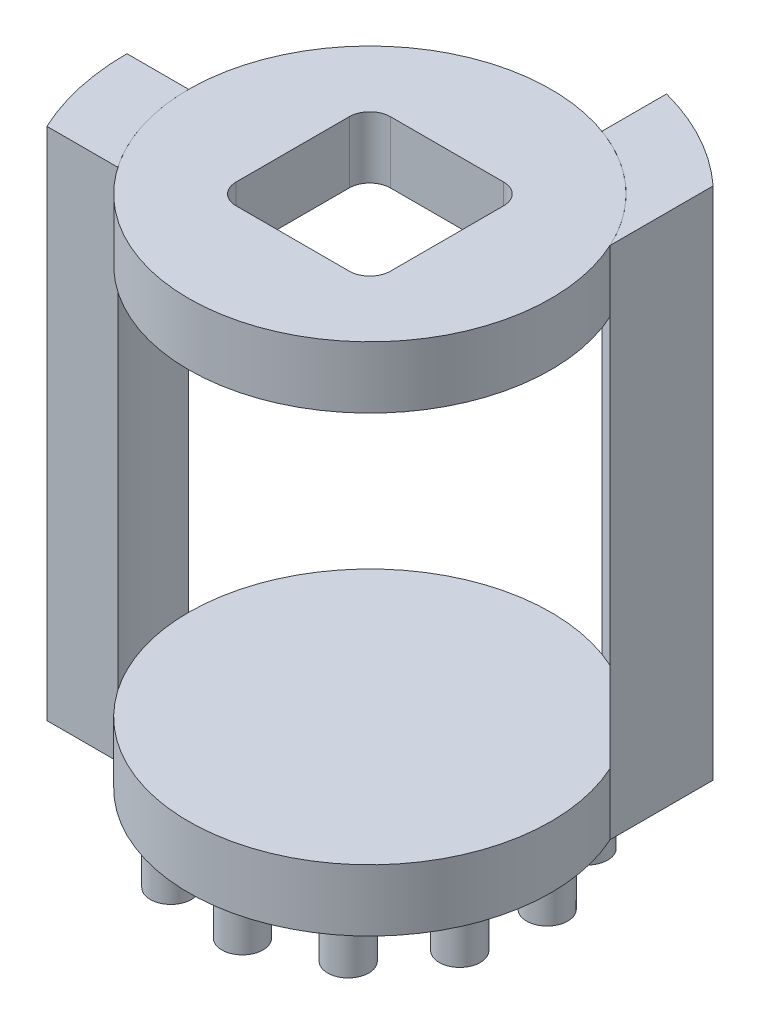
ISO-10303-21;
HEADER;
FILE_DESCRIPTION(('STEP AP214'),'2;1');
FILE_NAME('part.step','',(''),(''),'','','');
FILE_SCHEMA(('AUTOMOTIVE_DESIGN { 1 0 10303 214 1 1 1 1 }'));
ENDSEC;
DATA;
#1=APPLICATION_CONTEXT('core data for automotive mechanical design processes');
#2=APPLICATION_PROTOCOL_DEFINITION('international standard','automotive_design',2000,#1);
#3=PRODUCT_CONTEXT('',#1,'mechanical');
#4=PRODUCT('Part','Part','',(#3));
#5=PRODUCT_RELATED_PRODUCT_CATEGORY('part','',(#4));
#6=PRODUCT_DEFINITION_FORMATION('','',#4);
#7=PRODUCT_DEFINITION_CONTEXT('part definition',#1,'design');
#8=PRODUCT_DEFINITION('design','',#6,#7);
#9=PRODUCT_DEFINITION_SHAPE('','',#8);
#10=(LENGTH_UNIT() NAMED_UNIT(*) SI_UNIT(.MILLI.,.METRE.));
#11=(NAMED_UNIT(*) PLANE_ANGLE_UNIT() SI_UNIT($,.RADIAN.));
#12=(NAMED_UNIT(*) SI_UNIT($,.STERADIAN.) SOLID_ANGLE_UNIT());
#13=UNCERTAINTY_MEASURE_WITH_UNIT(LENGTH_MEASURE(1.E-05),#10,'distance_accuracy_value','');
#14=(GEOMETRIC_REPRESENTATION_CONTEXT(3) GLOBAL_UNCERTAINTY_ASSIGNED_CONTEXT((#13)) GLOBAL_UNIT_ASSIGNED_CONTEXT((#10,
#11,#12)) REPRESENTATION_CONTEXT('',''));
#15=CARTESIAN_POINT('',(0.,0.,0.));
#16=DIRECTION('',(0.,0.,1.));
#17=DIRECTION('',(1.,0.,0.));
#18=AXIS2_PLACEMENT_3D('',#15,#16,#17);
#19=CARTESIAN_POINT('',(0.,-19.,0.));
#20=DIRECTION('',(0.,-1.,0.));
#21=DIRECTION('',(0.,0.,-1.));
#22=AXIS2_PLACEMENT_3D('',#19,#20,#21);
#23=CYLINDRICAL_SURFACE('',#22,8.8);
#24=DIRECTION('',(0.,1.,0.));
#25=VECTOR('',#24,1.);
#26=CARTESIAN_POINT('',(3.,-22.,-8.27284715197857));
#27=LINE('',#26,#25);
#28=CARTESIAN_POINT('',(3.,-22.,-8.27284715197857));
#29=VERTEX_POINT('',#28);
#30=CARTESIAN_POINT('',(3.,-19.,-8.27284715197857));
#31=VERTEX_POINT('',#30);
#32=EDGE_CURVE('E191',#29,#31,#27,.T.);
#33=ORIENTED_EDGE('',*,*,#32,.F.);
#34=CARTESIAN_POINT('',(0.,-22.,0.));
#35=DIRECTION('',(0.,-1.,0.));
#36=DIRECTION('',(1.,0.,0.));
#37=AXIS2_PLACEMENT_3D('',#34,#35,#36);
#38=CIRCLE('',#37,8.8);
#39=CARTESIAN_POINT('',(-8.8,-22.,0.));
#40=VERTEX_POINT('',#39);
#41=EDGE_CURVE('E142',#29,#40,#38,.F.);
#42=ORIENTED_EDGE('',*,*,#41,.T.);
#43=DIRECTION('',(0.,1.,0.));
#44=VECTOR('',#43,1.);
#45=CARTESIAN_POINT('',(-8.8,-22.,0.));
#46=LINE('',#45,#44);
#47=CARTESIAN_POINT('',(-8.8,-19.,0.));
#48=VERTEX_POINT('',#47);
#49=EDGE_CURVE('E12',#40,#48,#46,.T.);
#50=ORIENTED_EDGE('',*,*,#49,.T.);
#51=CARTESIAN_POINT('',(0.,-19.,0.));
#52=DIRECTION('',(0.,-1.,0.));
#53=DIRECTION('',(0.,0.,-1.));
#54=AXIS2_PLACEMENT_3D('',#51,#52,#53);
#55=CIRCLE('',#54,8.8);
#56=EDGE_CURVE('E184',#48,#31,#55,.T.);
#57=ORIENTED_EDGE('',*,*,#56,.T.);
#58=EDGE_LOOP('',(#33,#42,#50,#57));
#59=FACE_BOUND('',#58,.T.);
#60=ADVANCED_FACE('F45',(#59),#23,.T.);
#61=DIRECTION('',(0.,1.,0.));
#62=VECTOR('',#61,1.);
#63=CARTESIAN_POINT('',(-7.24154679609267,-22.,5.));
#64=LINE('',#63,#62);
#65=CARTESIAN_POINT('',(-7.24154679609267,-22.,5.));
#66=VERTEX_POINT('',#65);
#67=CARTESIAN_POINT('',(-7.24154679609267,-19.,5.));
#68=VERTEX_POINT('',#67);
#69=EDGE_CURVE('E130',#66,#68,#64,.T.);
#70=ORIENTED_EDGE('',*,*,#69,.F.);
#71=CARTESIAN_POINT('',(8.,-22.,-3.66606055596467));
#72=VERTEX_POINT('',#71);
#73=EDGE_CURVE('E136',#66,#72,#38,.F.);
#74=ORIENTED_EDGE('',*,*,#73,.T.);
#75=DIRECTION('',(0.,1.,0.));
#76=VECTOR('',#75,1.);
#77=CARTESIAN_POINT('',(8.,-22.,-3.66606055596467));
#78=LINE('',#77,#76);
#79=CARTESIAN_POINT('',(8.,-19.,-3.66606055596467));
#80=VERTEX_POINT('',#79);
#81=EDGE_CURVE('E195',#72,#80,#78,.T.);
#82=ORIENTED_EDGE('',*,*,#81,.T.);
#83=EDGE_CURVE('E146',#80,#68,#55,.T.);
#84=ORIENTED_EDGE('',*,*,#83,.T.);
#85=EDGE_LOOP('',(#70,#74,#82,#84));
#86=FACE_BOUND('',#85,.T.);
#87=ADVANCED_FACE('F145',(#86),#23,.T.);
#88=CARTESIAN_POINT('',(0.,-22.,0.));
#89=DIRECTION('',(0.,1.,0.));
#90=DIRECTION('',(0.,0.,1.));
#91=AXIS2_PLACEMENT_3D('',#88,#89,#90);
#92=PLANE('',#91);
#93=DIRECTION('',(1.,0.,0.));
#94=VECTOR('',#93,1.);
#95=CARTESIAN_POINT('',(0.,-22.,0.));
#96=LINE('',#95,#94);
#97=CARTESIAN_POINT('',(-11.8,-22.,0.));
#98=VERTEX_POINT('',#97);
#99=EDGE_CURVE('E160',#98,#40,#96,.T.);
#100=ORIENTED_EDGE('',*,*,#99,.T.);
#101=ORIENTED_EDGE('',*,*,#41,.F.);
#102=DIRECTION('',(0.,0.,1.));
#103=VECTOR('',#102,1.);
#104=CARTESIAN_POINT('',(3.,-22.,0.));
#105=LINE('',#104,#103);
#106=CARTESIAN_POINT('',(3.,-22.,-11.4122740941497));
#107=VERTEX_POINT('',#106);
#108=EDGE_CURVE('E188',#107,#29,#105,.T.);
#109=ORIENTED_EDGE('',*,*,#108,.F.);
#110=CARTESIAN_POINT('',(0.,-22.,0.));
#111=DIRECTION('',(0.,1.,0.));
#112=DIRECTION('',(0.,0.,1.));
#113=AXIS2_PLACEMENT_3D('',#110,#111,#112);
#114=CIRCLE('',#113,11.8);
#115=CARTESIAN_POINT('',(8.,-22.,-8.67409937688058));
#116=VERTEX_POINT('',#115);
#117=EDGE_CURVE('E210',#116,#107,#114,.T.);
#118=ORIENTED_EDGE('',*,*,#117,.F.);
#119=DIRECTION('',(0.,0.,1.));
#120=VECTOR('',#119,1.);
#121=CARTESIAN_POINT('',(8.,-22.,0.));
#122=LINE('',#121,#120);
#123=EDGE_CURVE('E62',#116,#72,#122,.T.);
#124=ORIENTED_EDGE('',*,*,#123,.T.);
#125=ORIENTED_EDGE('',*,*,#73,.F.);
#126=DIRECTION('',(1.,0.,0.));
#127=VECTOR('',#126,1.);
#128=CARTESIAN_POINT('',(0.,-22.,5.));
#129=LINE('',#128,#127);
#130=CARTESIAN_POINT('',(-10.6883113727099,-22.,5.));
#131=VERTEX_POINT('',#130);
#132=EDGE_CURVE('E126',#131,#66,#129,.T.);
#133=ORIENTED_EDGE('',*,*,#132,.F.);
#134=CARTESIAN_POINT('',(0.,-22.,0.));
#135=DIRECTION('',(0.,1.,0.));
#136=DIRECTION('',(0.,0.,1.));
#137=AXIS2_PLACEMENT_3D('',#134,#135,#136);
#138=CIRCLE('',#137,11.8);
#139=EDGE_CURVE('E134',#98,#131,#138,.T.);
#140=ORIENTED_EDGE('',*,*,#139,.F.);
#141=EDGE_LOOP('',(#100,#101,#109,#118,#124,#125,#133,#140));
#142=FACE_BOUND('',#141,.T.);
#143=CARTESIAN_POINT('',(-2.64993878922471,-22.,7.01624970403795));
#144=DIRECTION('',(0.,-1.,0.));
#145=DIRECTION('',(0.353326597156537,0.,-0.935500035137243));
#146=AXIS2_PLACEMENT_3D('',#143,#144,#145);
#147=CIRCLE('',#146,1.);
#148=CARTESIAN_POINT('',(-2.29661219206817,-22.,6.08074966890071));
#149=VERTEX_POINT('',#148);
#150=EDGE_CURVE('E223',#149,#149,#147,.T.);
#151=ORIENTED_EDGE('',*,*,#150,.F.);
#152=EDGE_LOOP('',(#151));
#153=FACE_BOUND('',#152,.T.);
#154=CARTESIAN_POINT('',(-5.80303800959238,-22.,4.75127566869726));
#155=DIRECTION('',(0.,-1.,0.));
#156=DIRECTION('',(0.773739826538894,0.,-0.633503497091818));
#157=AXIS2_PLACEMENT_3D('',#154,#155,#156);
#158=CIRCLE('',#157,1.);
#159=CARTESIAN_POINT('',(-5.02929818305349,-22.,4.11777217160544));
#160=VERTEX_POINT('',#159);
#161=EDGE_CURVE('E266',#160,#160,#158,.T.);
#162=ORIENTED_EDGE('',*,*,#161,.F.);
#163=EDGE_LOOP('',(#162));
#164=FACE_BOUND('',#163,.T.);
#165=CARTESIAN_POINT('',(-7.40121501741335,-22.,1.21320100499623));
#166=DIRECTION('',(0.,-1.,0.));
#167=DIRECTION('',(0.986830094248356,0.,-0.161760208598347));
#168=AXIS2_PLACEMENT_3D('',#165,#166,#167);
#169=CIRCLE('',#168,1.);
#170=CARTESIAN_POINT('',(-6.41438492316499,-22.,1.05144079639789));
#171=VERTEX_POINT('',#170);
#172=EDGE_CURVE('E260',#171,#171,#169,.T.);
#173=ORIENTED_EDGE('',*,*,#172,.F.);
#174=EDGE_LOOP('',(#173));
#175=FACE_BOUND('',#174,.T.);
#176=CARTESIAN_POINT('',(-7.01623957407999,-22.,-2.64995003816543));
#177=DIRECTION('',(0.,-1.,0.));
#178=DIRECTION('',(0.935500035137241,0.,0.353326597156541));
#179=AXIS2_PLACEMENT_3D('',#176,#177,#178);
#180=CIRCLE('',#179,1.);
#181=CARTESIAN_POINT('',(-6.08073953894274,-22.,-2.29662344100888));
#182=VERTEX_POINT('',#181);
#183=EDGE_CURVE('E254',#182,#182,#180,.T.);
#184=ORIENTED_EDGE('',*,*,#183,.F.);
#185=EDGE_LOOP('',(#184));
#186=FACE_BOUND('',#185,.T.);
#187=CARTESIAN_POINT('',(-4.75126553873933,-22.,-5.80304925853306));
#188=DIRECTION('',(0.,-1.,0.));
#189=DIRECTION('',(0.63350349709182,0.,0.773739826538892));
#190=AXIS2_PLACEMENT_3D('',#187,#188,#189);
#191=CIRCLE('',#190,1.);
#192=CARTESIAN_POINT('',(-4.11776204164751,-22.,-5.02930943199417));
#193=VERTEX_POINT('',#192);
#194=EDGE_CURVE('E248',#193,#193,#191,.T.);
#195=ORIENTED_EDGE('',*,*,#194,.F.);
#196=EDGE_LOOP('',(#195));
#197=FACE_BOUND('',#196,.T.);
#198=CARTESIAN_POINT('',(-1.21319087503825,-22.,-7.40122626635405));
#199=DIRECTION('',(0.,-1.,0.));
#200=DIRECTION('',(0.161760208598343,0.,0.986830094248357));
#201=AXIS2_PLACEMENT_3D('',#198,#199,#200);
#202=CIRCLE('',#201,1.);
#203=CARTESIAN_POINT('',(-1.05143066643991,-22.,-6.41439617210569));
#204=VERTEX_POINT('',#203);
#205=EDGE_CURVE('E242',#204,#204,#202,.T.);
#206=ORIENTED_EDGE('',*,*,#205,.F.);
#207=EDGE_LOOP('',(#206));
#208=FACE_BOUND('',#207,.T.);
#209=CARTESIAN_POINT('',(2.64996016812341,-22.,-7.01625082302067));
#210=DIRECTION('',(0.,-1.,0.));
#211=DIRECTION('',(-0.353326597156544,0.,0.93550003513724));
#212=AXIS2_PLACEMENT_3D('',#209,#210,#211);
#213=CIRCLE('',#212,1.);
#214=CARTESIAN_POINT('',(2.29663357096686,-22.,-6.08075078788343));
#215=VERTEX_POINT('',#214);
#216=EDGE_CURVE('E236',#215,#215,#213,.T.);
#217=ORIENTED_EDGE('',*,*,#216,.F.);
#218=EDGE_LOOP('',(#217));
#219=FACE_BOUND('',#218,.T.);
#220=CARTESIAN_POINT('',(5.80305938849106,-22.,-4.75127678767996));
#221=DIRECTION('',(0.,-1.,0.));
#222=DIRECTION('',(-0.773739826538899,0.,0.633503497091812));
#223=AXIS2_PLACEMENT_3D('',#220,#221,#222);
#224=CIRCLE('',#223,1.);
#225=CARTESIAN_POINT('',(5.02931956195216,-22.,-4.11777329058815));
#226=VERTEX_POINT('',#225);
#227=EDGE_CURVE('E229',#226,#226,#224,.T.);
#228=ORIENTED_EDGE('',*,*,#227,.F.);
#229=EDGE_LOOP('',(#228));
#230=FACE_BOUND('',#229,.T.);
#231=CARTESIAN_POINT('',(7.40123639631201,-22.,-1.21320212397892));
#232=DIRECTION('',(0.,-1.,0.));
#233=DIRECTION('',(-0.986830094248357,0.,0.16176020859834));
#234=AXIS2_PLACEMENT_3D('',#231,#232,#233);
#235=CIRCLE('',#234,1.);
#236=CARTESIAN_POINT('',(6.41440630206365,-22.,-1.05144191538058));
#237=VERTEX_POINT('',#236);
#238=EDGE_CURVE('E230',#237,#237,#235,.T.);
#239=ORIENTED_EDGE('',*,*,#238,.F.);
#240=EDGE_LOOP('',(#239));
#241=FACE_BOUND('',#240,.T.);
#242=CARTESIAN_POINT('',(7.01626095297862,-22.,2.64994891918273));
#243=DIRECTION('',(0.,-1.,0.));
#244=DIRECTION('',(-0.935500035137239,0.,-0.353326597156547));
#245=AXIS2_PLACEMENT_3D('',#242,#243,#244);
#246=CIRCLE('',#245,1.);
#247=CARTESIAN_POINT('',(6.08076091784138,-22.,2.29662232202619));
#248=VERTEX_POINT('',#247);
#249=EDGE_CURVE('E277',#248,#248,#246,.T.);
#250=ORIENTED_EDGE('',*,*,#249,.F.);
#251=EDGE_LOOP('',(#250));
#252=FACE_BOUND('',#251,.T.);
#253=CARTESIAN_POINT('',(1.21321225393695,-22.,7.4012251473713));
#254=DIRECTION('',(0.,-1.,0.));
#255=DIRECTION('',(-0.16176020859835,0.,-0.986830094248356));
#256=AXIS2_PLACEMENT_3D('',#253,#254,#255);
#257=CIRCLE('',#256,1.);
#258=CARTESIAN_POINT('',(1.0514520453386,-22.,6.41439505312294));
#259=VERTEX_POINT('',#258);
#260=EDGE_CURVE('E217',#259,#259,#257,.T.);
#261=ORIENTED_EDGE('',*,*,#260,.F.);
#262=EDGE_LOOP('',(#261));
#263=FACE_BOUND('',#262,.T.);
#264=CARTESIAN_POINT('',(4.75128691763798,-22.,5.80304813955032));
#265=DIRECTION('',(0.,-1.,0.));
#266=DIRECTION('',(-0.63350349709182,0.,-0.773739826538892));
#267=AXIS2_PLACEMENT_3D('',#264,#265,#266);
#268=CIRCLE('',#267,1.);
#269=CARTESIAN_POINT('',(4.11778342054616,-22.,5.02930831301143));
#270=VERTEX_POINT('',#269);
#271=EDGE_CURVE('E143',#270,#270,#268,.T.);
#272=ORIENTED_EDGE('',*,*,#271,.F.);
#273=EDGE_LOOP('',(#272));
#274=FACE_BOUND('',#273,.T.);
#275=ADVANCED_FACE('F137',(#142,#153,#164,#175,#186,#197,#208,#219,#230,#241,#252,#263,#274),
#92,.F.);
#276=CARTESIAN_POINT('',(0.,-22.,0.));
#277=DIRECTION('',(0.,1.,0.));
#278=DIRECTION('',(0.,0.,1.));
#279=AXIS2_PLACEMENT_3D('',#276,#277,#278);
#280=CYLINDRICAL_SURFACE('',#279,8.8);
#281=EDGE_CURVE('E169',#68,#48,#55,.T.);
#282=ORIENTED_EDGE('',*,*,#281,.T.);
#283=CARTESIAN_POINT('',(-8.8,3.,0.));
#284=VERTEX_POINT('',#283);
#285=EDGE_CURVE('E54',#48,#284,#46,.T.);
#286=ORIENTED_EDGE('',*,*,#285,.T.);
#287=CARTESIAN_POINT('',(0.,3.,0.));
#288=DIRECTION('',(0.,1.,0.));
#289=DIRECTION('',(0.,0.,1.));
#290=AXIS2_PLACEMENT_3D('',#287,#288,#289);
#291=CIRCLE('',#290,8.8);
#292=CARTESIAN_POINT('',(-7.24154679609267,3.,5.));
#293=VERTEX_POINT('',#292);
#294=EDGE_CURVE('E168',#284,#293,#291,.T.);
#295=ORIENTED_EDGE('',*,*,#294,.T.);
#296=EDGE_CURVE('E148',#68,#293,#64,.T.);
#297=ORIENTED_EDGE('',*,*,#296,.F.);
#298=EDGE_LOOP('',(#282,#286,#295,#297));
#299=FACE_BOUND('',#298,.T.);
#300=ADVANCED_FACE('F291',(#299),#280,.F.);
#301=CARTESIAN_POINT('',(0.,-22.,0.));
#302=DIRECTION('',(0.,0.,1.));
#303=DIRECTION('',(1.,0.,0.));
#304=AXIS2_PLACEMENT_3D('',#301,#302,#303);
#305=PLANE('',#304);
#306=DIRECTION('',(1.,0.,0.));
#307=VECTOR('',#306,1.);
#308=CARTESIAN_POINT('',(0.,3.,0.));
#309=LINE('',#308,#307);
#310=CARTESIAN_POINT('',(-11.8,3.,0.));
#311=VERTEX_POINT('',#310);
#312=EDGE_CURVE('E158',#311,#284,#309,.T.);
#313=ORIENTED_EDGE('',*,*,#312,.T.);
#314=ORIENTED_EDGE('',*,*,#285,.F.);
#315=ORIENTED_EDGE('',*,*,#49,.F.);
#316=ORIENTED_EDGE('',*,*,#99,.F.);
#317=DIRECTION('',(0.,1.,0.));
#318=VECTOR('',#317,1.);
#319=CARTESIAN_POINT('',(-11.8,-22.,0.));
#320=LINE('',#319,#318);
#321=EDGE_CURVE('E49',#98,#311,#320,.T.);
#322=ORIENTED_EDGE('',*,*,#321,.T.);
#323=EDGE_LOOP('',(#313,#314,#315,#316,#322));
#324=FACE_BOUND('',#323,.T.);
#325=ADVANCED_FACE('F47',(#324),#305,.F.);
#326=CARTESIAN_POINT('',(0.,-22.,5.));
#327=DIRECTION('',(0.,0.,1.));
#328=DIRECTION('',(1.,0.,0.));
#329=AXIS2_PLACEMENT_3D('',#326,#327,#328);
#330=PLANE('',#329);
#331=DIRECTION('',(1.,0.,0.));
#332=VECTOR('',#331,1.);
#333=CARTESIAN_POINT('',(0.,3.,5.));
#334=LINE('',#333,#332);
#335=CARTESIAN_POINT('',(-10.6883113727099,3.,5.));
#336=VERTEX_POINT('',#335);
#337=EDGE_CURVE('E172',#336,#293,#334,.T.);
#338=ORIENTED_EDGE('',*,*,#337,.F.);
#339=DIRECTION('',(0.,1.,0.));
#340=VECTOR('',#339,1.);
#341=CARTESIAN_POINT('',(-10.6883113727099,-22.,5.));
#342=LINE('',#341,#340);
#343=EDGE_CURVE('E131',#131,#336,#342,.T.);
#344=ORIENTED_EDGE('',*,*,#343,.F.);
#345=ORIENTED_EDGE('',*,*,#132,.T.);
#346=ORIENTED_EDGE('',*,*,#69,.T.);
#347=ORIENTED_EDGE('',*,*,#296,.T.);
#348=EDGE_LOOP('',(#338,#344,#345,#346,#347));
#349=FACE_BOUND('',#348,.T.);
#350=ADVANCED_FACE('F128',(#349),#330,.T.);
#351=CARTESIAN_POINT('',(0.,-22.,0.));
#352=DIRECTION('',(0.,1.,0.));
#353=DIRECTION('',(0.,0.,1.));
#354=AXIS2_PLACEMENT_3D('',#351,#352,#353);
#355=CYLINDRICAL_SURFACE('',#354,11.8);
#356=CARTESIAN_POINT('',(0.,3.,0.));
#357=DIRECTION('',(0.,1.,0.));
#358=DIRECTION('',(0.,0.,1.));
#359=AXIS2_PLACEMENT_3D('',#356,#357,#358);
#360=CIRCLE('',#359,11.8);
#361=EDGE_CURVE('E166',#311,#336,#360,.T.);
#362=ORIENTED_EDGE('',*,*,#361,.F.);
#363=ORIENTED_EDGE('',*,*,#321,.F.);
#364=ORIENTED_EDGE('',*,*,#139,.T.);
#365=ORIENTED_EDGE('',*,*,#343,.T.);
#366=EDGE_LOOP('',(#362,#363,#364,#365));
#367=FACE_BOUND('',#366,.T.);
#368=ADVANCED_FACE('F171',(#367),#355,.T.);
#369=CARTESIAN_POINT('',(0.,3.,0.));
#370=DIRECTION('',(0.,1.,0.));
#371=DIRECTION('',(0.,0.,1.));
#372=AXIS2_PLACEMENT_3D('',#369,#370,#371);
#373=PLANE('',#372);
#374=ORIENTED_EDGE('',*,*,#312,.F.);
#375=ORIENTED_EDGE('',*,*,#361,.T.);
#376=ORIENTED_EDGE('',*,*,#337,.T.);
#377=ORIENTED_EDGE('',*,*,#294,.F.);
#378=EDGE_LOOP('',(#374,#375,#376,#377));
#379=FACE_BOUND('',#378,.T.);
#380=ADVANCED_FACE('F164',(#379),#373,.T.);
#381=CARTESIAN_POINT('',(0.,-19.,0.));
#382=DIRECTION('',(0.,-1.,0.));
#383=DIRECTION('',(0.,0.,-1.));
#384=AXIS2_PLACEMENT_3D('',#381,#382,#383);
#385=PLANE('',#384);
#386=ORIENTED_EDGE('',*,*,#281,.F.);
#387=ORIENTED_EDGE('',*,*,#83,.F.);
#388=EDGE_CURVE('E70',#31,#80,#55,.T.);
#389=ORIENTED_EDGE('',*,*,#388,.F.);
#390=ORIENTED_EDGE('',*,*,#56,.F.);
#391=EDGE_LOOP('',(#386,#387,#389,#390));
#392=FACE_BOUND('',#391,.T.);
#393=ADVANCED_FACE('F329',(#392),#385,.F.);
#394=CARTESIAN_POINT('',(0.,-22.,0.));
#395=DIRECTION('',(0.,1.,0.));
#396=DIRECTION('',(0.,0.,1.));
#397=AXIS2_PLACEMENT_3D('',#394,#395,#396);
#398=CYLINDRICAL_SURFACE('',#397,8.8);
#399=CARTESIAN_POINT('',(3.,3.,-8.27284715197857));
#400=VERTEX_POINT('',#399);
#401=EDGE_CURVE('E190',#31,#400,#27,.T.);
#402=ORIENTED_EDGE('',*,*,#401,.F.);
#403=ORIENTED_EDGE('',*,*,#388,.T.);
#404=CARTESIAN_POINT('',(8.,3.,-3.66606055596467));
#405=VERTEX_POINT('',#404);
#406=EDGE_CURVE('E194',#80,#405,#78,.T.);
#407=ORIENTED_EDGE('',*,*,#406,.T.);
#408=CARTESIAN_POINT('',(0.,3.,0.));
#409=DIRECTION('',(0.,1.,0.));
#410=DIRECTION('',(0.,0.,1.));
#411=AXIS2_PLACEMENT_3D('',#408,#409,#410);
#412=CIRCLE('',#411,8.8);
#413=EDGE_CURVE('E197',#405,#400,#412,.T.);
#414=ORIENTED_EDGE('',*,*,#413,.T.);
#415=EDGE_LOOP('',(#402,#403,#407,#414));
#416=FACE_BOUND('',#415,.T.);
#417=ADVANCED_FACE('F354',(#416),#398,.F.);
#418=CARTESIAN_POINT('',(8.,-22.,0.));
#419=DIRECTION('',(-1.,0.,0.));
#420=DIRECTION('',(0.,0.,1.));
#421=AXIS2_PLACEMENT_3D('',#418,#419,#420);
#422=PLANE('',#421);
#423=DIRECTION('',(0.,0.,1.));
#424=VECTOR('',#423,1.);
#425=CARTESIAN_POINT('',(8.,3.,0.));
#426=LINE('',#425,#424);
#427=CARTESIAN_POINT('',(8.,3.,-8.67409937688058));
#428=VERTEX_POINT('',#427);
#429=EDGE_CURVE('E206',#428,#405,#426,.T.);
#430=ORIENTED_EDGE('',*,*,#429,.T.);
#431=ORIENTED_EDGE('',*,*,#406,.F.);
#432=ORIENTED_EDGE('',*,*,#81,.F.);
#433=ORIENTED_EDGE('',*,*,#123,.F.);
#434=DIRECTION('',(0.,1.,0.));
#435=VECTOR('',#434,1.);
#436=CARTESIAN_POINT('',(8.,-22.,-8.67409937688058));
#437=LINE('',#436,#435);
#438=EDGE_CURVE('E185',#116,#428,#437,.T.);
#439=ORIENTED_EDGE('',*,*,#438,.T.);
#440=EDGE_LOOP('',(#430,#431,#432,#433,#439));
#441=FACE_BOUND('',#440,.T.);
#442=ADVANCED_FACE('F360',(#441),#422,.F.);
#443=CARTESIAN_POINT('',(3.,-22.,0.));
#444=DIRECTION('',(-1.,0.,0.));
#445=DIRECTION('',(0.,0.,1.));
#446=AXIS2_PLACEMENT_3D('',#443,#444,#445);
#447=PLANE('',#446);
#448=DIRECTION('',(0.,0.,1.));
#449=VECTOR('',#448,1.);
#450=CARTESIAN_POINT('',(3.,3.,0.));
#451=LINE('',#450,#449);
#452=CARTESIAN_POINT('',(3.,3.,-11.4122740941497));
#453=VERTEX_POINT('',#452);
#454=EDGE_CURVE('E200',#453,#400,#451,.T.);
#455=ORIENTED_EDGE('',*,*,#454,.F.);
#456=DIRECTION('',(0.,1.,0.));
#457=VECTOR('',#456,1.);
#458=CARTESIAN_POINT('',(3.,-22.,-11.4122740941497));
#459=LINE('',#458,#457);
#460=EDGE_CURVE('E187',#107,#453,#459,.T.);
#461=ORIENTED_EDGE('',*,*,#460,.F.);
#462=ORIENTED_EDGE('',*,*,#108,.T.);
#463=ORIENTED_EDGE('',*,*,#32,.T.);
#464=ORIENTED_EDGE('',*,*,#401,.T.);
#465=EDGE_LOOP('',(#455,#461,#462,#463,#464));
#466=FACE_BOUND('',#465,.T.);
#467=ADVANCED_FACE('F369',(#466),#447,.T.);
#468=CARTESIAN_POINT('',(0.,-22.,0.));
#469=DIRECTION('',(0.,1.,0.));
#470=DIRECTION('',(0.,0.,1.));
#471=AXIS2_PLACEMENT_3D('',#468,#469,#470);
#472=CYLINDRICAL_SURFACE('',#471,11.8);
#473=CARTESIAN_POINT('',(0.,3.,0.));
#474=DIRECTION('',(0.,1.,0.));
#475=DIRECTION('',(0.,0.,1.));
#476=AXIS2_PLACEMENT_3D('',#473,#474,#475);
#477=CIRCLE('',#476,11.8);
#478=EDGE_CURVE('E203',#428,#453,#477,.T.);
#479=ORIENTED_EDGE('',*,*,#478,.F.);
#480=ORIENTED_EDGE('',*,*,#438,.F.);
#481=ORIENTED_EDGE('',*,*,#117,.T.);
#482=ORIENTED_EDGE('',*,*,#460,.T.);
#483=EDGE_LOOP('',(#479,#480,#481,#482));
#484=FACE_BOUND('',#483,.T.);
#485=ADVANCED_FACE('F376',(#484),#472,.T.);
#486=CARTESIAN_POINT('',(0.,3.,0.));
#487=DIRECTION('',(0.,1.,0.));
#488=DIRECTION('',(0.,0.,1.));
#489=AXIS2_PLACEMENT_3D('',#486,#487,#488);
#490=PLANE('',#489);
#491=ORIENTED_EDGE('',*,*,#429,.F.);
#492=ORIENTED_EDGE('',*,*,#478,.T.);
#493=ORIENTED_EDGE('',*,*,#454,.T.);
#494=ORIENTED_EDGE('',*,*,#413,.F.);
#495=EDGE_LOOP('',(#491,#492,#493,#494));
#496=FACE_BOUND('',#495,.T.);
#497=ADVANCED_FACE('F303',(#496),#490,.T.);
#498=CARTESIAN_POINT('',(4.75128691763798,-22.,5.80304813955032));
#499=DIRECTION('',(0.,-1.,0.));
#500=DIRECTION('',(-0.63350349709182,0.,-0.773739826538892));
#501=AXIS2_PLACEMENT_3D('',#498,#499,#500);
#502=CYLINDRICAL_SURFACE('',#501,1.);
#503=ORIENTED_EDGE('',*,*,#271,.T.);
#504=EDGE_LOOP('',(#503));
#505=FACE_BOUND('',#504,.T.);
#506=CARTESIAN_POINT('',(4.75128691763798,-24.,5.80304813955032));
#507=DIRECTION('',(0.,-1.,0.));
#508=DIRECTION('',(-0.63350349709182,0.,-0.773739826538892));
#509=AXIS2_PLACEMENT_3D('',#506,#507,#508);
#510=CIRCLE('',#509,1.);
#511=CARTESIAN_POINT('',(4.11778342054616,-24.,5.02930831301143));
#512=VERTEX_POINT('',#511);
#513=EDGE_CURVE('E214',#512,#512,#510,.T.);
#514=ORIENTED_EDGE('',*,*,#513,.F.);
#515=EDGE_LOOP('',(#514));
#516=FACE_BOUND('',#515,.T.);
#517=ADVANCED_FACE('F299',(#505,#516),#502,.T.);
#518=CARTESIAN_POINT('',(1.21321225393695,-22.,7.4012251473713));
#519=DIRECTION('',(0.,-1.,0.));
#520=DIRECTION('',(-0.63350349709182,0.,-0.773739826538892));
#521=AXIS2_PLACEMENT_3D('',#518,#519,#520);
#522=CYLINDRICAL_SURFACE('',#521,1.);
#523=ORIENTED_EDGE('',*,*,#260,.T.);
#524=EDGE_LOOP('',(#523));
#525=FACE_BOUND('',#524,.T.);
#526=CARTESIAN_POINT('',(1.21321225393696,-24.,7.4012251473713));
#527=DIRECTION('',(0.,-1.,0.));
#528=DIRECTION('',(-0.16176020859835,0.,-0.986830094248356));
#529=AXIS2_PLACEMENT_3D('',#526,#527,#528);
#530=CIRCLE('',#529,1.);
#531=CARTESIAN_POINT('',(1.05145204533861,-24.,6.41439505312294));
#532=VERTEX_POINT('',#531);
#533=EDGE_CURVE('E220',#532,#532,#530,.T.);
#534=ORIENTED_EDGE('',*,*,#533,.F.);
#535=EDGE_LOOP('',(#534));
#536=FACE_BOUND('',#535,.T.);
#537=ADVANCED_FACE('F302',(#525,#536),#522,.T.);
#538=CARTESIAN_POINT('',(7.01626095297862,-22.,2.64994891918273));
#539=DIRECTION('',(0.,-1.,0.));
#540=DIRECTION('',(-0.63350349709182,0.,-0.773739826538892));
#541=AXIS2_PLACEMENT_3D('',#538,#539,#540);
#542=CYLINDRICAL_SURFACE('',#541,1.);
#543=ORIENTED_EDGE('',*,*,#249,.T.);
#544=EDGE_LOOP('',(#543));
#545=FACE_BOUND('',#544,.T.);
#546=CARTESIAN_POINT('',(7.01626095297862,-24.,2.64994891918273));
#547=DIRECTION('',(0.,-1.,0.));
#548=DIRECTION('',(-0.935500035137239,0.,-0.353326597156547));
#549=AXIS2_PLACEMENT_3D('',#546,#547,#548);
#550=CIRCLE('',#549,1.);
#551=CARTESIAN_POINT('',(6.08076091784138,-24.,2.29662232202619));
#552=VERTEX_POINT('',#551);
#553=EDGE_CURVE('E274',#552,#552,#550,.T.);
#554=ORIENTED_EDGE('',*,*,#553,.F.);
#555=EDGE_LOOP('',(#554));
#556=FACE_BOUND('',#555,.T.);
#557=ADVANCED_FACE('F400',(#545,#556),#542,.T.);
#558=CARTESIAN_POINT('',(7.40123639631201,-22.,-1.21320212397892));
#559=DIRECTION('',(0.,-1.,0.));
#560=DIRECTION('',(-0.63350349709182,0.,-0.773739826538892));
#561=AXIS2_PLACEMENT_3D('',#558,#559,#560);
#562=CYLINDRICAL_SURFACE('',#561,1.);
#563=ORIENTED_EDGE('',*,*,#238,.T.);
#564=EDGE_LOOP('',(#563));
#565=FACE_BOUND('',#564,.T.);
#566=CARTESIAN_POINT('',(7.40123639631201,-24.,-1.21320212397892));
#567=DIRECTION('',(0.,-1.,0.));
#568=DIRECTION('',(-0.986830094248357,0.,0.16176020859834));
#569=AXIS2_PLACEMENT_3D('',#566,#567,#568);
#570=CIRCLE('',#569,1.);
#571=CARTESIAN_POINT('',(6.41440630206365,-24.,-1.05144191538058));
#572=VERTEX_POINT('',#571);
#573=EDGE_CURVE('E280',#572,#572,#570,.T.);
#574=ORIENTED_EDGE('',*,*,#573,.F.);
#575=EDGE_LOOP('',(#574));
#576=FACE_BOUND('',#575,.T.);
#577=ADVANCED_FACE('F286',(#565,#576),#562,.T.);
#578=CARTESIAN_POINT('',(5.80305938849106,-22.,-4.75127678767996));
#579=DIRECTION('',(0.,-1.,0.));
#580=DIRECTION('',(-0.63350349709182,0.,-0.773739826538892));
#581=AXIS2_PLACEMENT_3D('',#578,#579,#580);
#582=CYLINDRICAL_SURFACE('',#581,1.);
#583=ORIENTED_EDGE('',*,*,#227,.T.);
#584=EDGE_LOOP('',(#583));
#585=FACE_BOUND('',#584,.T.);
#586=CARTESIAN_POINT('',(5.80305938849107,-24.,-4.75127678767996));
#587=DIRECTION('',(0.,-1.,0.));
#588=DIRECTION('',(-0.773739826538899,0.,0.633503497091812));
#589=AXIS2_PLACEMENT_3D('',#586,#587,#588);
#590=CIRCLE('',#589,1.);
#591=CARTESIAN_POINT('',(5.02931956195217,-24.,-4.11777329058815));
#592=VERTEX_POINT('',#591);
#593=EDGE_CURVE('E226',#592,#592,#590,.T.);
#594=ORIENTED_EDGE('',*,*,#593,.F.);
#595=EDGE_LOOP('',(#594));
#596=FACE_BOUND('',#595,.T.);
#597=ADVANCED_FACE('F415',(#585,#596),#582,.T.);
#598=CARTESIAN_POINT('',(2.64996016812341,-22.,-7.01625082302067));
#599=DIRECTION('',(0.,-1.,0.));
#600=DIRECTION('',(-0.63350349709182,0.,-0.773739826538892));
#601=AXIS2_PLACEMENT_3D('',#598,#599,#600);
#602=CYLINDRICAL_SURFACE('',#601,1.);
#603=ORIENTED_EDGE('',*,*,#216,.T.);
#604=EDGE_LOOP('',(#603));
#605=FACE_BOUND('',#604,.T.);
#606=CARTESIAN_POINT('',(2.64996016812341,-24.,-7.01625082302067));
#607=DIRECTION('',(0.,-1.,0.));
#608=DIRECTION('',(-0.353326597156544,0.,0.93550003513724));
#609=AXIS2_PLACEMENT_3D('',#606,#607,#608);
#610=CIRCLE('',#609,1.);
#611=CARTESIAN_POINT('',(2.29663357096686,-24.,-6.08075078788343));
#612=VERTEX_POINT('',#611);
#613=EDGE_CURVE('E233',#612,#612,#610,.T.);
#614=ORIENTED_EDGE('',*,*,#613,.F.);
#615=EDGE_LOOP('',(#614));
#616=FACE_BOUND('',#615,.T.);
#617=ADVANCED_FACE('F422',(#605,#616),#602,.T.);
#618=CARTESIAN_POINT('',(-1.21319087503825,-22.,-7.40122626635405));
#619=DIRECTION('',(0.,-1.,0.));
#620=DIRECTION('',(-0.63350349709182,0.,-0.773739826538892));
#621=AXIS2_PLACEMENT_3D('',#618,#619,#620);
#622=CYLINDRICAL_SURFACE('',#621,1.);
#623=ORIENTED_EDGE('',*,*,#205,.T.);
#624=EDGE_LOOP('',(#623));
#625=FACE_BOUND('',#624,.T.);
#626=CARTESIAN_POINT('',(-1.21319087503825,-24.,-7.40122626635405));
#627=DIRECTION('',(0.,-1.,0.));
#628=DIRECTION('',(0.161760208598343,0.,0.986830094248357));
#629=AXIS2_PLACEMENT_3D('',#626,#627,#628);
#630=CIRCLE('',#629,1.);
#631=CARTESIAN_POINT('',(-1.0514306664399,-24.,-6.41439617210569));
#632=VERTEX_POINT('',#631);
#633=EDGE_CURVE('E239',#632,#632,#630,.T.);
#634=ORIENTED_EDGE('',*,*,#633,.F.);
#635=EDGE_LOOP('',(#634));
#636=FACE_BOUND('',#635,.T.);
#637=ADVANCED_FACE('F430',(#625,#636),#622,.T.);
#638=CARTESIAN_POINT('',(-4.75126553873933,-22.,-5.80304925853306));
#639=DIRECTION('',(0.,-1.,0.));
#640=DIRECTION('',(-0.63350349709182,0.,-0.773739826538892));
#641=AXIS2_PLACEMENT_3D('',#638,#639,#640);
#642=CYLINDRICAL_SURFACE('',#641,1.);
#643=ORIENTED_EDGE('',*,*,#194,.T.);
#644=EDGE_LOOP('',(#643));
#645=FACE_BOUND('',#644,.T.);
#646=CARTESIAN_POINT('',(-4.75126553873932,-24.,-5.80304925853306));
#647=DIRECTION('',(0.,-1.,0.));
#648=DIRECTION('',(0.63350349709182,0.,0.773739826538892));
#649=AXIS2_PLACEMENT_3D('',#646,#647,#648);
#650=CIRCLE('',#649,1.);
#651=CARTESIAN_POINT('',(-4.1177620416475,-24.,-5.02930943199417));
#652=VERTEX_POINT('',#651);
#653=EDGE_CURVE('E245',#652,#652,#650,.T.);
#654=ORIENTED_EDGE('',*,*,#653,.F.);
#655=EDGE_LOOP('',(#654));
#656=FACE_BOUND('',#655,.T.);
#657=ADVANCED_FACE('F438',(#645,#656),#642,.T.);
#658=CARTESIAN_POINT('',(-7.01623957407999,-22.,-2.64995003816543));
#659=DIRECTION('',(0.,-1.,0.));
#660=DIRECTION('',(-0.63350349709182,0.,-0.773739826538892));
#661=AXIS2_PLACEMENT_3D('',#658,#659,#660);
#662=CYLINDRICAL_SURFACE('',#661,1.);
#663=ORIENTED_EDGE('',*,*,#183,.T.);
#664=EDGE_LOOP('',(#663));
#665=FACE_BOUND('',#664,.T.);
#666=CARTESIAN_POINT('',(-7.01623957407998,-24.,-2.64995003816543));
#667=DIRECTION('',(0.,-1.,0.));
#668=DIRECTION('',(0.935500035137241,0.,0.353326597156541));
#669=AXIS2_PLACEMENT_3D('',#666,#667,#668);
#670=CIRCLE('',#669,1.);
#671=CARTESIAN_POINT('',(-6.08073953894274,-24.,-2.29662344100889));
#672=VERTEX_POINT('',#671);
#673=EDGE_CURVE('E251',#672,#672,#670,.T.);
#674=ORIENTED_EDGE('',*,*,#673,.F.);
#675=EDGE_LOOP('',(#674));
#676=FACE_BOUND('',#675,.T.);
#677=ADVANCED_FACE('F446',(#665,#676),#662,.T.);
#678=CARTESIAN_POINT('',(-7.40121501741335,-22.,1.21320100499623));
#679=DIRECTION('',(0.,-1.,0.));
#680=DIRECTION('',(-0.63350349709182,0.,-0.773739826538892));
#681=AXIS2_PLACEMENT_3D('',#678,#679,#680);
#682=CYLINDRICAL_SURFACE('',#681,1.);
#683=ORIENTED_EDGE('',*,*,#172,.T.);
#684=EDGE_LOOP('',(#683));
#685=FACE_BOUND('',#684,.T.);
#686=CARTESIAN_POINT('',(-7.40121501741334,-24.,1.21320100499623));
#687=DIRECTION('',(0.,-1.,0.));
#688=DIRECTION('',(0.986830094248356,0.,-0.161760208598347));
#689=AXIS2_PLACEMENT_3D('',#686,#687,#688);
#690=CIRCLE('',#689,1.);
#691=CARTESIAN_POINT('',(-6.41438492316499,-24.,1.05144079639788));
#692=VERTEX_POINT('',#691);
#693=EDGE_CURVE('E257',#692,#692,#690,.T.);
#694=ORIENTED_EDGE('',*,*,#693,.F.);
#695=EDGE_LOOP('',(#694));
#696=FACE_BOUND('',#695,.T.);
#697=ADVANCED_FACE('F454',(#685,#696),#682,.T.);
#698=CARTESIAN_POINT('',(-5.80303800959238,-22.,4.75127566869726));
#699=DIRECTION('',(0.,-1.,0.));
#700=DIRECTION('',(-0.63350349709182,0.,-0.773739826538892));
#701=AXIS2_PLACEMENT_3D('',#698,#699,#700);
#702=CYLINDRICAL_SURFACE('',#701,1.);
#703=ORIENTED_EDGE('',*,*,#161,.T.);
#704=EDGE_LOOP('',(#703));
#705=FACE_BOUND('',#704,.T.);
#706=CARTESIAN_POINT('',(-5.80303800959238,-24.,4.75127566869726));
#707=DIRECTION('',(0.,-1.,0.));
#708=DIRECTION('',(0.773739826538894,0.,-0.633503497091818));
#709=AXIS2_PLACEMENT_3D('',#706,#707,#708);
#710=CIRCLE('',#709,1.);
#711=CARTESIAN_POINT('',(-5.02929818305348,-24.,4.11777217160544));
#712=VERTEX_POINT('',#711);
#713=EDGE_CURVE('E263',#712,#712,#710,.T.);
#714=ORIENTED_EDGE('',*,*,#713,.F.);
#715=EDGE_LOOP('',(#714));
#716=FACE_BOUND('',#715,.T.);
#717=ADVANCED_FACE('F462',(#705,#716),#702,.T.);
#718=CARTESIAN_POINT('',(-2.64993878922471,-22.,7.01624970403795));
#719=DIRECTION('',(0.,-1.,0.));
#720=DIRECTION('',(-0.63350349709182,0.,-0.773739826538892));
#721=AXIS2_PLACEMENT_3D('',#718,#719,#720);
#722=CYLINDRICAL_SURFACE('',#721,1.);
#723=ORIENTED_EDGE('',*,*,#150,.T.);
#724=EDGE_LOOP('',(#723));
#725=FACE_BOUND('',#724,.T.);
#726=CARTESIAN_POINT('',(-2.6499387892247,-24.,7.01624970403795));
#727=DIRECTION('',(0.,-1.,0.));
#728=DIRECTION('',(0.353326597156537,0.,-0.935500035137243));
#729=AXIS2_PLACEMENT_3D('',#726,#727,#728);
#730=CIRCLE('',#729,1.);
#731=CARTESIAN_POINT('',(-2.29661219206816,-24.,6.08074966890071));
#732=VERTEX_POINT('',#731);
#733=EDGE_CURVE('E269',#732,#732,#730,.T.);
#734=ORIENTED_EDGE('',*,*,#733,.F.);
#735=EDGE_LOOP('',(#734));
#736=FACE_BOUND('',#735,.T.);
#737=ADVANCED_FACE('F470',(#725,#736),#722,.T.);
#738=CARTESIAN_POINT('',(0.,-24.,0.));
#739=DIRECTION('',(0.,-1.,0.));
#740=DIRECTION('',(0.,0.,-1.));
#741=AXIS2_PLACEMENT_3D('',#738,#739,#740);
#742=PLANE('',#741);
#743=ORIENTED_EDGE('',*,*,#713,.T.);
#744=EDGE_LOOP('',(#743));
#745=FACE_BOUND('',#744,.T.);
#746=ADVANCED_FACE('F317',(#745),#742,.T.);
#747=ORIENTED_EDGE('',*,*,#693,.T.);
#748=EDGE_LOOP('',(#747));
#749=FACE_BOUND('',#748,.T.);
#750=ADVANCED_FACE('F485',(#749),#742,.T.);
#751=ORIENTED_EDGE('',*,*,#673,.T.);
#752=EDGE_LOOP('',(#751));
#753=FACE_BOUND('',#752,.T.);
#754=ADVANCED_FACE('F492',(#753),#742,.T.);
#755=ORIENTED_EDGE('',*,*,#653,.T.);
#756=EDGE_LOOP('',(#755));
#757=FACE_BOUND('',#756,.T.);
#758=ADVANCED_FACE('F499',(#757),#742,.T.);
#759=ORIENTED_EDGE('',*,*,#633,.T.);
#760=EDGE_LOOP('',(#759));
#761=FACE_BOUND('',#760,.T.);
#762=ADVANCED_FACE('F506',(#761),#742,.T.);
#763=ORIENTED_EDGE('',*,*,#613,.T.);
#764=EDGE_LOOP('',(#763));
#765=FACE_BOUND('',#764,.T.);
#766=ADVANCED_FACE('F513',(#765),#742,.T.);
#767=ORIENTED_EDGE('',*,*,#593,.T.);
#768=EDGE_LOOP('',(#767));
#769=FACE_BOUND('',#768,.T.);
#770=ADVANCED_FACE('F520',(#769),#742,.T.);
#771=ORIENTED_EDGE('',*,*,#573,.T.);
#772=EDGE_LOOP('',(#771));
#773=FACE_BOUND('',#772,.T.);
#774=ADVANCED_FACE('F527',(#773),#742,.T.);
#775=ORIENTED_EDGE('',*,*,#553,.T.);
#776=EDGE_LOOP('',(#775));
#777=FACE_BOUND('',#776,.T.);
#778=ADVANCED_FACE('F318',(#777),#742,.T.);
#779=ORIENTED_EDGE('',*,*,#533,.T.);
#780=EDGE_LOOP('',(#779));
#781=FACE_BOUND('',#780,.T.);
#782=ADVANCED_FACE('F310',(#781),#742,.T.);
#783=ORIENTED_EDGE('',*,*,#513,.T.);
#784=EDGE_LOOP('',(#783));
#785=FACE_BOUND('',#784,.T.);
#786=ADVANCED_FACE('F307',(#785),#742,.T.);
#787=ORIENTED_EDGE('',*,*,#733,.T.);
#788=EDGE_LOOP('',(#787));
#789=FACE_BOUND('',#788,.T.);
#790=ADVANCED_FACE('F309',(#789),#742,.T.);
#791=CLOSED_SHELL('',(#60,#87,#275,#300,#325,#350,#368,#380,#393,#417,#442,#467,#485,#497,#517,
#537,#557,#577,#597,#617,#637,#657,#677,#697,#717,#737,#746,#750,#754,#758,#762,#766,#770,#774,
#778,#782,#786,#790));
#792=MANIFOLD_SOLID_BREP('B2',#791);
#793=CARTESIAN_POINT('',(0.,3.,0.));
#794=DIRECTION('',(0.,1.,0.));
#795=DIRECTION('',(0.,0.,1.));
#796=AXIS2_PLACEMENT_3D('',#793,#794,#795);
#797=PLANE('',#796);
#798=CARTESIAN_POINT('',(0.,3.,0.));
#799=DIRECTION('',(0.,1.,0.));
#800=DIRECTION('',(0.,0.,1.));
#801=AXIS2_PLACEMENT_3D('',#798,#799,#800);
#802=CIRCLE('',#801,8.8);
#803=CARTESIAN_POINT('',(0.,3.,8.8));
#804=VERTEX_POINT('',#803);
#805=EDGE_CURVE('E802',#804,#804,#802,.T.);
#806=ORIENTED_EDGE('',*,*,#805,.T.);
#807=EDGE_LOOP('',(#806));
#808=FACE_BOUND('',#807,.T.);
#809=DIRECTION('',(1.,0.,0.));
#810=VECTOR('',#809,1.);
#811=CARTESIAN_POINT('',(3.75,3.,3.75));
#812=LINE('',#811,#810);
#813=CARTESIAN_POINT('',(-2.75,3.,3.75));
#814=VERTEX_POINT('',#813);
#815=CARTESIAN_POINT('',(2.75,3.,3.75));
#816=VERTEX_POINT('',#815);
#817=EDGE_CURVE('E849',#814,#816,#812,.T.);
#818=ORIENTED_EDGE('',*,*,#817,.F.);
#819=CARTESIAN_POINT('',(-2.75,3.,2.75));
#820=DIRECTION('',(0.,1.,0.));
#821=DIRECTION('',(0.,0.,1.));
#822=AXIS2_PLACEMENT_3D('',#819,#820,#821);
#823=CIRCLE('',#822,1.);
#824=CARTESIAN_POINT('',(-3.75,3.,2.75));
#825=VERTEX_POINT('',#824);
#826=EDGE_CURVE('E729',#814,#825,#823,.F.);
#827=ORIENTED_EDGE('',*,*,#826,.T.);
#828=DIRECTION('',(0.,0.,1.));
#829=VECTOR('',#828,1.);
#830=CARTESIAN_POINT('',(-3.75,3.,3.75));
#831=LINE('',#830,#829);
#832=CARTESIAN_POINT('',(-3.75,3.,-2.75));
#833=VERTEX_POINT('',#832);
#834=EDGE_CURVE('E841',#833,#825,#831,.T.);
#835=ORIENTED_EDGE('',*,*,#834,.F.);
#836=CARTESIAN_POINT('',(-2.75,3.,-2.75));
#837=DIRECTION('',(0.,1.,0.));
#838=DIRECTION('',(0.,0.,1.));
#839=AXIS2_PLACEMENT_3D('',#836,#837,#838);
#840=CIRCLE('',#839,1.);
#841=CARTESIAN_POINT('',(-2.75,3.,-3.75));
#842=VERTEX_POINT('',#841);
#843=EDGE_CURVE('E43',#833,#842,#840,.F.);
#844=ORIENTED_EDGE('',*,*,#843,.T.);
#845=DIRECTION('',(-1.,0.,0.));
#846=VECTOR('',#845,1.);
#847=CARTESIAN_POINT('',(3.75,3.,-3.75));
#848=LINE('',#847,#846);
#849=CARTESIAN_POINT('',(2.75,3.,-3.75));
#850=VERTEX_POINT('',#849);
#851=EDGE_CURVE('E839',#850,#842,#848,.T.);
#852=ORIENTED_EDGE('',*,*,#851,.F.);
#853=CARTESIAN_POINT('',(2.75,3.,-2.75));
#854=DIRECTION('',(0.,1.,0.));
#855=DIRECTION('',(0.,0.,1.));
#856=AXIS2_PLACEMENT_3D('',#853,#854,#855);
#857=CIRCLE('',#856,1.);
#858=CARTESIAN_POINT('',(3.75,3.,-2.75));
#859=VERTEX_POINT('',#858);
#860=EDGE_CURVE('E790',#850,#859,#857,.F.);
#861=ORIENTED_EDGE('',*,*,#860,.T.);
#862=DIRECTION('',(0.,0.,-1.));
#863=VECTOR('',#862,1.);
#864=CARTESIAN_POINT('',(3.75,3.,3.75));
#865=LINE('',#864,#863);
#866=CARTESIAN_POINT('',(3.75,3.,2.75));
#867=VERTEX_POINT('',#866);
#868=EDGE_CURVE('E845',#867,#859,#865,.T.);
#869=ORIENTED_EDGE('',*,*,#868,.F.);
#870=CARTESIAN_POINT('',(2.75,3.,2.75));
#871=DIRECTION('',(0.,1.,0.));
#872=DIRECTION('',(0.,0.,1.));
#873=AXIS2_PLACEMENT_3D('',#870,#871,#872);
#874=CIRCLE('',#873,1.);
#875=EDGE_CURVE('E825',#867,#816,#874,.F.);
#876=ORIENTED_EDGE('',*,*,#875,.T.);
#877=EDGE_LOOP('',(#818,#827,#835,#844,#852,#861,#869,#876));
#878=FACE_BOUND('',#877,.T.);
#879=ADVANCED_FACE('F714',(#808,#878),#797,.T.);
#880=CARTESIAN_POINT('',(0.,0.,0.));
#881=DIRECTION('',(0.,1.,0.));
#882=DIRECTION('',(0.,0.,1.));
#883=AXIS2_PLACEMENT_3D('',#880,#881,#882);
#884=PLANE('',#883);
#885=CARTESIAN_POINT('',(0.,0.,0.));
#886=DIRECTION('',(0.,1.,0.));
#887=DIRECTION('',(0.,0.,1.));
#888=AXIS2_PLACEMENT_3D('',#885,#886,#887);
#889=CIRCLE('',#888,8.8);
#890=CARTESIAN_POINT('',(0.,0.,8.8));
#891=VERTEX_POINT('',#890);
#892=EDGE_CURVE('E807',#891,#891,#889,.T.);
#893=ORIENTED_EDGE('',*,*,#892,.F.);
#894=EDGE_LOOP('',(#893));
#895=FACE_BOUND('',#894,.T.);
#896=DIRECTION('',(-1.,0.,0.));
#897=VECTOR('',#896,1.);
#898=CARTESIAN_POINT('',(3.75,0.,-3.75));
#899=LINE('',#898,#897);
#900=CARTESIAN_POINT('',(2.75,0.,-3.75));
#901=VERTEX_POINT('',#900);
#902=CARTESIAN_POINT('',(-2.75,0.,-3.75));
#903=VERTEX_POINT('',#902);
#904=EDGE_CURVE('E831',#901,#903,#899,.T.);
#905=ORIENTED_EDGE('',*,*,#904,.T.);
#906=CARTESIAN_POINT('',(-2.75,0.,-2.75));
#907=DIRECTION('',(0.,1.,0.));
#908=DIRECTION('',(0.,0.,1.));
#909=AXIS2_PLACEMENT_3D('',#906,#907,#908);
#910=CIRCLE('',#909,1.);
#911=CARTESIAN_POINT('',(-3.75,0.,-2.75));
#912=VERTEX_POINT('',#911);
#913=EDGE_CURVE('E722',#903,#912,#910,.T.);
#914=ORIENTED_EDGE('',*,*,#913,.T.);
#915=DIRECTION('',(0.,0.,1.));
#916=VECTOR('',#915,1.);
#917=CARTESIAN_POINT('',(-3.75,0.,3.75));
#918=LINE('',#917,#916);
#919=CARTESIAN_POINT('',(-3.75,0.,2.75));
#920=VERTEX_POINT('',#919);
#921=EDGE_CURVE('E785',#912,#920,#918,.T.);
#922=ORIENTED_EDGE('',*,*,#921,.T.);
#923=CARTESIAN_POINT('',(-2.75,0.,2.75));
#924=DIRECTION('',(0.,1.,0.));
#925=DIRECTION('',(0.,0.,1.));
#926=AXIS2_PLACEMENT_3D('',#923,#924,#925);
#927=CIRCLE('',#926,1.);
#928=CARTESIAN_POINT('',(-2.75,0.,3.75));
#929=VERTEX_POINT('',#928);
#930=EDGE_CURVE('E780',#920,#929,#927,.T.);
#931=ORIENTED_EDGE('',*,*,#930,.T.);
#932=DIRECTION('',(1.,0.,0.));
#933=VECTOR('',#932,1.);
#934=CARTESIAN_POINT('',(3.75,0.,3.75));
#935=LINE('',#934,#933);
#936=CARTESIAN_POINT('',(2.75,0.,3.75));
#937=VERTEX_POINT('',#936);
#938=EDGE_CURVE('E784',#929,#937,#935,.T.);
#939=ORIENTED_EDGE('',*,*,#938,.T.);
#940=CARTESIAN_POINT('',(2.75,0.,2.75));
#941=DIRECTION('',(0.,1.,0.));
#942=DIRECTION('',(0.,0.,1.));
#943=AXIS2_PLACEMENT_3D('',#940,#941,#942);
#944=CIRCLE('',#943,1.);
#945=CARTESIAN_POINT('',(3.75,0.,2.75));
#946=VERTEX_POINT('',#945);
#947=EDGE_CURVE('E823',#937,#946,#944,.T.);
#948=ORIENTED_EDGE('',*,*,#947,.T.);
#949=DIRECTION('',(0.,0.,-1.));
#950=VECTOR('',#949,1.);
#951=CARTESIAN_POINT('',(3.75,0.,3.75));
#952=LINE('',#951,#950);
#953=CARTESIAN_POINT('',(3.75,0.,-2.75));
#954=VERTEX_POINT('',#953);
#955=EDGE_CURVE('E799',#946,#954,#952,.T.);
#956=ORIENTED_EDGE('',*,*,#955,.T.);
#957=CARTESIAN_POINT('',(2.75,0.,-2.75));
#958=DIRECTION('',(0.,1.,0.));
#959=DIRECTION('',(0.,0.,1.));
#960=AXIS2_PLACEMENT_3D('',#957,#958,#959);
#961=CIRCLE('',#960,1.);
#962=EDGE_CURVE('E827',#954,#901,#961,.T.);
#963=ORIENTED_EDGE('',*,*,#962,.T.);
#964=EDGE_LOOP('',(#905,#914,#922,#931,#939,#948,#956,#963));
#965=FACE_BOUND('',#964,.T.);
#966=ADVANCED_FACE('F783',(#895,#965),#884,.F.);
#967=CARTESIAN_POINT('',(0.,3.,0.));
#968=DIRECTION('',(0.,-1.,0.));
#969=DIRECTION('',(0.,0.,-1.));
#970=AXIS2_PLACEMENT_3D('',#967,#968,#969);
#971=CYLINDRICAL_SURFACE('',#970,8.8);
#972=ORIENTED_EDGE('',*,*,#805,.F.);
#973=EDGE_LOOP('',(#972));
#974=FACE_BOUND('',#973,.T.);
#975=ORIENTED_EDGE('',*,*,#892,.T.);
#976=EDGE_LOOP('',(#975));
#977=FACE_BOUND('',#976,.T.);
#978=ADVANCED_FACE('F880',(#974,#977),#971,.T.);
#979=CARTESIAN_POINT('',(-3.75,3.,3.75));
#980=DIRECTION('',(1.,0.,0.));
#981=DIRECTION('',(0.,0.,-1.));
#982=AXIS2_PLACEMENT_3D('',#979,#980,#981);
#983=PLANE('',#982);
#984=ORIENTED_EDGE('',*,*,#834,.T.);
#985=DIRECTION('',(0.,-1.,0.));
#986=VECTOR('',#985,1.);
#987=CARTESIAN_POINT('',(-3.75,0.,2.75));
#988=LINE('',#987,#986);
#989=EDGE_CURVE('E821',#825,#920,#988,.T.);
#990=ORIENTED_EDGE('',*,*,#989,.T.);
#991=ORIENTED_EDGE('',*,*,#921,.F.);
#992=DIRECTION('',(0.,-1.,0.));
#993=VECTOR('',#992,1.);
#994=CARTESIAN_POINT('',(-3.75,3.,-2.75));
#995=LINE('',#994,#993);
#996=EDGE_CURVE('E736',#912,#833,#995,.F.);
#997=ORIENTED_EDGE('',*,*,#996,.T.);
#998=EDGE_LOOP('',(#984,#990,#991,#997));
#999=FACE_BOUND('',#998,.T.);
#1000=ADVANCED_FACE('F834',(#999),#983,.T.);
#1001=CARTESIAN_POINT('',(3.75,3.,3.75));
#1002=DIRECTION('',(0.,0.,-1.));
#1003=DIRECTION('',(-1.,0.,0.));
#1004=AXIS2_PLACEMENT_3D('',#1001,#1002,#1003);
#1005=PLANE('',#1004);
#1006=ORIENTED_EDGE('',*,*,#817,.T.);
#1007=DIRECTION('',(0.,-1.,0.));
#1008=VECTOR('',#1007,1.);
#1009=CARTESIAN_POINT('',(2.75,0.,3.75));
#1010=LINE('',#1009,#1008);
#1011=EDGE_CURVE('E798',#816,#937,#1010,.T.);
#1012=ORIENTED_EDGE('',*,*,#1011,.T.);
#1013=ORIENTED_EDGE('',*,*,#938,.F.);
#1014=DIRECTION('',(0.,-1.,0.));
#1015=VECTOR('',#1014,1.);
#1016=CARTESIAN_POINT('',(-2.75,3.,3.75));
#1017=LINE('',#1016,#1015);
#1018=EDGE_CURVE('E796',#929,#814,#1017,.F.);
#1019=ORIENTED_EDGE('',*,*,#1018,.T.);
#1020=EDGE_LOOP('',(#1006,#1012,#1013,#1019));
#1021=FACE_BOUND('',#1020,.T.);
#1022=ADVANCED_FACE('F795',(#1021),#1005,.T.);
#1023=CARTESIAN_POINT('',(3.75,3.,3.75));
#1024=DIRECTION('',(-1.,0.,0.));
#1025=DIRECTION('',(0.,0.,1.));
#1026=AXIS2_PLACEMENT_3D('',#1023,#1024,#1025);
#1027=PLANE('',#1026);
#1028=ORIENTED_EDGE('',*,*,#955,.F.);
#1029=DIRECTION('',(0.,-1.,0.));
#1030=VECTOR('',#1029,1.);
#1031=CARTESIAN_POINT('',(3.75,3.,2.75));
#1032=LINE('',#1031,#1030);
#1033=EDGE_CURVE('E813',#946,#867,#1032,.F.);
#1034=ORIENTED_EDGE('',*,*,#1033,.T.);
#1035=ORIENTED_EDGE('',*,*,#868,.T.);
#1036=DIRECTION('',(0.,-1.,0.));
#1037=VECTOR('',#1036,1.);
#1038=CARTESIAN_POINT('',(3.75,0.,-2.75));
#1039=LINE('',#1038,#1037);
#1040=EDGE_CURVE('E804',#859,#954,#1039,.T.);
#1041=ORIENTED_EDGE('',*,*,#1040,.T.);
#1042=EDGE_LOOP('',(#1028,#1034,#1035,#1041));
#1043=FACE_BOUND('',#1042,.T.);
#1044=ADVANCED_FACE('F862',(#1043),#1027,.T.);
#1045=CARTESIAN_POINT('',(3.75,3.,-3.75));
#1046=DIRECTION('',(0.,0.,1.));
#1047=DIRECTION('',(1.,0.,0.));
#1048=AXIS2_PLACEMENT_3D('',#1045,#1046,#1047);
#1049=PLANE('',#1048);
#1050=ORIENTED_EDGE('',*,*,#904,.F.);
#1051=DIRECTION('',(0.,-1.,0.));
#1052=VECTOR('',#1051,1.);
#1053=CARTESIAN_POINT('',(2.75,3.,-3.75));
#1054=LINE('',#1053,#1052);
#1055=EDGE_CURVE('E818',#901,#850,#1054,.F.);
#1056=ORIENTED_EDGE('',*,*,#1055,.T.);
#1057=ORIENTED_EDGE('',*,*,#851,.T.);
#1058=DIRECTION('',(0.,-1.,0.));
#1059=VECTOR('',#1058,1.);
#1060=CARTESIAN_POINT('',(-2.75,0.,-3.75));
#1061=LINE('',#1060,#1059);
#1062=EDGE_CURVE('E815',#842,#903,#1061,.T.);
#1063=ORIENTED_EDGE('',*,*,#1062,.T.);
#1064=EDGE_LOOP('',(#1050,#1056,#1057,#1063));
#1065=FACE_BOUND('',#1064,.T.);
#1066=ADVANCED_FACE('F843',(#1065),#1049,.T.);
#1067=CARTESIAN_POINT('',(2.75,3.,2.75));
#1068=DIRECTION('',(0.,1.,0.));
#1069=DIRECTION('',(0.,0.,1.));
#1070=AXIS2_PLACEMENT_3D('',#1067,#1068,#1069);
#1071=CYLINDRICAL_SURFACE('',#1070,1.);
#1072=ORIENTED_EDGE('',*,*,#875,.F.);
#1073=ORIENTED_EDGE('',*,*,#1033,.F.);
#1074=ORIENTED_EDGE('',*,*,#947,.F.);
#1075=ORIENTED_EDGE('',*,*,#1011,.F.);
#1076=EDGE_LOOP('',(#1072,#1073,#1074,#1075));
#1077=FACE_BOUND('',#1076,.T.);
#1078=ADVANCED_FACE('F858',(#1077),#1071,.F.);
#1079=CARTESIAN_POINT('',(2.75,3.,-2.75));
#1080=DIRECTION('',(0.,1.,0.));
#1081=DIRECTION('',(0.,0.,1.));
#1082=AXIS2_PLACEMENT_3D('',#1079,#1080,#1081);
#1083=CYLINDRICAL_SURFACE('',#1082,1.);
#1084=ORIENTED_EDGE('',*,*,#860,.F.);
#1085=ORIENTED_EDGE('',*,*,#1055,.F.);
#1086=ORIENTED_EDGE('',*,*,#962,.F.);
#1087=ORIENTED_EDGE('',*,*,#1040,.F.);
#1088=EDGE_LOOP('',(#1084,#1085,#1086,#1087));
#1089=FACE_BOUND('',#1088,.T.);
#1090=ADVANCED_FACE('F866',(#1089),#1083,.F.);
#1091=CARTESIAN_POINT('',(-2.75,3.,2.75));
#1092=DIRECTION('',(0.,1.,0.));
#1093=DIRECTION('',(0.,0.,1.));
#1094=AXIS2_PLACEMENT_3D('',#1091,#1092,#1093);
#1095=CYLINDRICAL_SURFACE('',#1094,1.);
#1096=ORIENTED_EDGE('',*,*,#826,.F.);
#1097=ORIENTED_EDGE('',*,*,#1018,.F.);
#1098=ORIENTED_EDGE('',*,*,#930,.F.);
#1099=ORIENTED_EDGE('',*,*,#989,.F.);
#1100=EDGE_LOOP('',(#1096,#1097,#1098,#1099));
#1101=FACE_BOUND('',#1100,.T.);
#1102=ADVANCED_FACE('F801',(#1101),#1095,.F.);
#1103=CARTESIAN_POINT('',(-2.75,3.,-2.75));
#1104=DIRECTION('',(0.,1.,0.));
#1105=DIRECTION('',(0.,0.,1.));
#1106=AXIS2_PLACEMENT_3D('',#1103,#1104,#1105);
#1107=CYLINDRICAL_SURFACE('',#1106,1.);
#1108=ORIENTED_EDGE('',*,*,#843,.F.);
#1109=ORIENTED_EDGE('',*,*,#996,.F.);
#1110=ORIENTED_EDGE('',*,*,#913,.F.);
#1111=ORIENTED_EDGE('',*,*,#1062,.F.);
#1112=EDGE_LOOP('',(#1108,#1109,#1110,#1111));
#1113=FACE_BOUND('',#1112,.T.);
#1114=ADVANCED_FACE('F716',(#1113),#1107,.F.);
#1115=CLOSED_SHELL('',(#879,#966,#978,#1000,#1022,#1044,#1066,#1078,#1090,#1102,#1114));
#1116=MANIFOLD_SOLID_BREP('B6',#1115);
#1117=ADVANCED_BREP_SHAPE_REPRESENTATION('',(#18,#792,#1116),#14);
#1118=SHAPE_DEFINITION_REPRESENTATION(#9,#1117);
ENDSEC;
END-ISO-10303-21;
